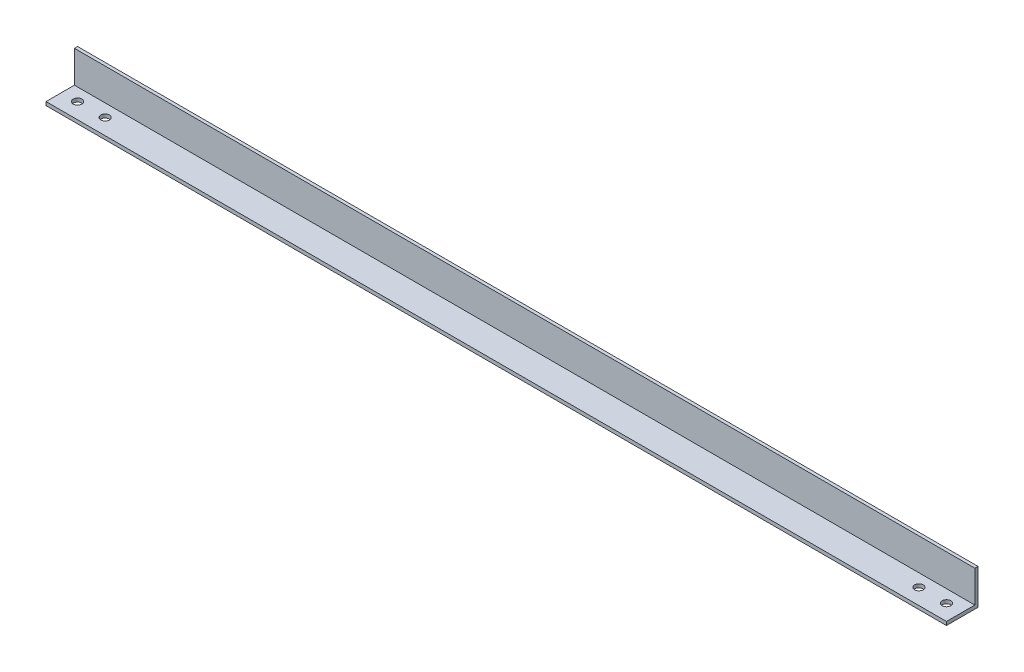
ISO-10303-21;
HEADER;
FILE_DESCRIPTION(('STEP AP214'),'2;1');
FILE_NAME('part.step','',(''),(''),'','','');
FILE_SCHEMA(('AUTOMOTIVE_DESIGN { 1 0 10303 214 1 1 1 1 }'));
ENDSEC;
DATA;
#1=APPLICATION_CONTEXT('core data for automotive mechanical design processes');
#2=APPLICATION_PROTOCOL_DEFINITION('international standard','automotive_design',2000,#1);
#3=PRODUCT_CONTEXT('',#1,'mechanical');
#4=PRODUCT('Part','Part','',(#3));
#5=PRODUCT_RELATED_PRODUCT_CATEGORY('part','',(#4));
#6=PRODUCT_DEFINITION_FORMATION('','',#4);
#7=PRODUCT_DEFINITION_CONTEXT('part definition',#1,'design');
#8=PRODUCT_DEFINITION('design','',#6,#7);
#9=PRODUCT_DEFINITION_SHAPE('','',#8);
#10=(LENGTH_UNIT() NAMED_UNIT(*) SI_UNIT(.MILLI.,.METRE.));
#11=(NAMED_UNIT(*) PLANE_ANGLE_UNIT() SI_UNIT($,.RADIAN.));
#12=(NAMED_UNIT(*) SI_UNIT($,.STERADIAN.) SOLID_ANGLE_UNIT());
#13=UNCERTAINTY_MEASURE_WITH_UNIT(LENGTH_MEASURE(1.E-05),#10,'distance_accuracy_value','');
#14=(GEOMETRIC_REPRESENTATION_CONTEXT(3) GLOBAL_UNCERTAINTY_ASSIGNED_CONTEXT((#13)) GLOBAL_UNIT_ASSIGNED_CONTEXT((#10,
#11,#12)) REPRESENTATION_CONTEXT('',''));
#15=CARTESIAN_POINT('',(0.,0.,0.));
#16=DIRECTION('',(0.,0.,1.));
#17=DIRECTION('',(1.,0.,0.));
#18=AXIS2_PLACEMENT_3D('',#15,#16,#17);
#19=CARTESIAN_POINT('',(0.,0.,8.));
#20=DIRECTION('',(0.,0.,-1.));
#21=DIRECTION('',(-1.,0.,0.));
#22=AXIS2_PLACEMENT_3D('',#19,#20,#21);
#23=PLANE('',#22);
#24=DIRECTION('',(-1.,0.,0.));
#25=VECTOR('',#24,1.);
#26=CARTESIAN_POINT('',(0.,9.,8.));
#27=LINE('',#26,#25);
#28=CARTESIAN_POINT('',(2284.,8.99999999999999,8.));
#29=VERTEX_POINT('',#28);
#30=CARTESIAN_POINT('',(0.,9.,8.));
#31=VERTEX_POINT('',#30);
#32=EDGE_CURVE('E48',#29,#31,#27,.T.);
#33=ORIENTED_EDGE('',*,*,#32,.F.);
#34=DIRECTION('',(0.,1.,0.));
#35=VECTOR('',#34,1.);
#36=CARTESIAN_POINT('',(2284.,0.,8.));
#37=LINE('',#36,#35);
#38=CARTESIAN_POINT('',(2284.,90.,8.));
#39=VERTEX_POINT('',#38);
#40=EDGE_CURVE('E108',#29,#39,#37,.T.);
#41=ORIENTED_EDGE('',*,*,#40,.T.);
#42=DIRECTION('',(-1.,0.,0.));
#43=VECTOR('',#42,1.);
#44=CARTESIAN_POINT('',(0.,90.,8.));
#45=LINE('',#44,#43);
#46=CARTESIAN_POINT('',(0.,90.,8.));
#47=VERTEX_POINT('',#46);
#48=EDGE_CURVE('E54',#39,#47,#45,.T.);
#49=ORIENTED_EDGE('',*,*,#48,.T.);
#50=DIRECTION('',(0.,-1.,0.));
#51=VECTOR('',#50,1.);
#52=CARTESIAN_POINT('',(0.,0.,8.));
#53=LINE('',#52,#51);
#54=EDGE_CURVE('E83',#47,#31,#53,.T.);
#55=ORIENTED_EDGE('',*,*,#54,.T.);
#56=EDGE_LOOP('',(#33,#41,#49,#55));
#57=FACE_BOUND('',#56,.T.);
#58=ADVANCED_FACE('F31',(#57),#23,.F.);
#59=CARTESIAN_POINT('',(0.,0.,8.));
#60=DIRECTION('',(1.,0.,0.));
#61=DIRECTION('',(0.,0.,-1.));
#62=AXIS2_PLACEMENT_3D('',#59,#60,#61);
#63=PLANE('',#62);
#64=DIRECTION('',(0.,-1.,0.));
#65=VECTOR('',#64,1.);
#66=CARTESIAN_POINT('',(0.,0.,0.));
#67=LINE('',#66,#65);
#68=CARTESIAN_POINT('',(0.,90.,0.));
#69=VERTEX_POINT('',#68);
#70=CARTESIAN_POINT('',(0.,0.,0.));
#71=VERTEX_POINT('',#70);
#72=EDGE_CURVE('E89',#69,#71,#67,.T.);
#73=ORIENTED_EDGE('',*,*,#72,.T.);
#74=DIRECTION('',(0.,0.,-1.));
#75=VECTOR('',#74,1.);
#76=CARTESIAN_POINT('',(0.,0.,8.));
#77=LINE('',#76,#75);
#78=CARTESIAN_POINT('',(0.,0.,80.));
#79=VERTEX_POINT('',#78);
#80=EDGE_CURVE('E11',#79,#71,#77,.T.);
#81=ORIENTED_EDGE('',*,*,#80,.F.);
#82=DIRECTION('',(0.,-1.,0.));
#83=VECTOR('',#82,1.);
#84=CARTESIAN_POINT('',(0.,0.,80.));
#85=LINE('',#84,#83);
#86=CARTESIAN_POINT('',(0.,9.,80.));
#87=VERTEX_POINT('',#86);
#88=EDGE_CURVE('E118',#87,#79,#85,.T.);
#89=ORIENTED_EDGE('',*,*,#88,.F.);
#90=DIRECTION('',(0.,0.,-1.));
#91=VECTOR('',#90,1.);
#92=CARTESIAN_POINT('',(0.,9.,80.));
#93=LINE('',#92,#91);
#94=EDGE_CURVE('E98',#87,#31,#93,.T.);
#95=ORIENTED_EDGE('',*,*,#94,.T.);
#96=ORIENTED_EDGE('',*,*,#54,.F.);
#97=DIRECTION('',(0.,0.,-1.));
#98=VECTOR('',#97,1.);
#99=CARTESIAN_POINT('',(0.,90.,8.));
#100=LINE('',#99,#98);
#101=EDGE_CURVE('E76',#47,#69,#100,.T.);
#102=ORIENTED_EDGE('',*,*,#101,.T.);
#103=EDGE_LOOP('',(#73,#81,#89,#95,#96,#102));
#104=FACE_BOUND('',#103,.T.);
#105=ADVANCED_FACE('F33',(#104),#63,.F.);
#106=CARTESIAN_POINT('',(0.,0.,8.));
#107=DIRECTION('',(0.,1.,0.));
#108=DIRECTION('',(0.,0.,1.));
#109=AXIS2_PLACEMENT_3D('',#106,#107,#108);
#110=PLANE('',#109);
#111=CARTESIAN_POINT('',(2244.05,0.,40.));
#112=DIRECTION('',(0.,1.,0.));
#113=DIRECTION('',(0.,0.,1.));
#114=AXIS2_PLACEMENT_3D('',#111,#112,#113);
#115=CIRCLE('',#114,11.0000000000001);
#116=CARTESIAN_POINT('',(2244.05,0.,51.0000000000002));
#117=VERTEX_POINT('',#116);
#118=EDGE_CURVE('E154',#117,#117,#115,.T.);
#119=ORIENTED_EDGE('',*,*,#118,.T.);
#120=EDGE_LOOP('',(#119));
#121=FACE_BOUND('',#120,.T.);
#122=CARTESIAN_POINT('',(2174.05,0.,40.));
#123=DIRECTION('',(0.,1.,0.));
#124=DIRECTION('',(0.,0.,1.));
#125=AXIS2_PLACEMENT_3D('',#122,#123,#124);
#126=CIRCLE('',#125,11.0000000000001);
#127=CARTESIAN_POINT('',(2174.05,0.,51.0000000000001));
#128=VERTEX_POINT('',#127);
#129=EDGE_CURVE('E148',#128,#128,#126,.T.);
#130=ORIENTED_EDGE('',*,*,#129,.T.);
#131=EDGE_LOOP('',(#130));
#132=FACE_BOUND('',#131,.T.);
#133=CARTESIAN_POINT('',(109.95,0.,40.));
#134=DIRECTION('',(0.,1.,0.));
#135=DIRECTION('',(0.,0.,1.));
#136=AXIS2_PLACEMENT_3D('',#133,#134,#135);
#137=CIRCLE('',#136,11.);
#138=CARTESIAN_POINT('',(109.95,0.,51.));
#139=VERTEX_POINT('',#138);
#140=EDGE_CURVE('E142',#139,#139,#137,.T.);
#141=ORIENTED_EDGE('',*,*,#140,.T.);
#142=EDGE_LOOP('',(#141));
#143=FACE_BOUND('',#142,.T.);
#144=CARTESIAN_POINT('',(39.95,0.,40.));
#145=DIRECTION('',(0.,1.,0.));
#146=DIRECTION('',(0.,0.,1.));
#147=AXIS2_PLACEMENT_3D('',#144,#145,#146);
#148=CIRCLE('',#147,11.);
#149=CARTESIAN_POINT('',(39.95,0.,51.));
#150=VERTEX_POINT('',#149);
#151=EDGE_CURVE('E119',#150,#150,#148,.T.);
#152=ORIENTED_EDGE('',*,*,#151,.T.);
#153=EDGE_LOOP('',(#152));
#154=FACE_BOUND('',#153,.T.);
#155=DIRECTION('',(1.,0.,0.));
#156=VECTOR('',#155,1.);
#157=CARTESIAN_POINT('',(0.,0.,0.));
#158=LINE('',#157,#156);
#159=CARTESIAN_POINT('',(2284.,0.,0.));
#160=VERTEX_POINT('',#159);
#161=EDGE_CURVE('E93',#71,#160,#158,.T.);
#162=ORIENTED_EDGE('',*,*,#161,.T.);
#163=DIRECTION('',(0.,0.,-1.));
#164=VECTOR('',#163,1.);
#165=CARTESIAN_POINT('',(2284.,0.,8.));
#166=LINE('',#165,#164);
#167=CARTESIAN_POINT('',(2284.,0.,80.));
#168=VERTEX_POINT('',#167);
#169=EDGE_CURVE('E40',#168,#160,#166,.T.);
#170=ORIENTED_EDGE('',*,*,#169,.F.);
#171=DIRECTION('',(1.,0.,0.));
#172=VECTOR('',#171,1.);
#173=CARTESIAN_POINT('',(0.,0.,80.));
#174=LINE('',#173,#172);
#175=EDGE_CURVE('E131',#79,#168,#174,.T.);
#176=ORIENTED_EDGE('',*,*,#175,.F.);
#177=ORIENTED_EDGE('',*,*,#80,.T.);
#178=EDGE_LOOP('',(#162,#170,#176,#177));
#179=FACE_BOUND('',#178,.T.);
#180=ADVANCED_FACE('F163',(#121,#132,#143,#154,#179),#110,.F.);
#181=CARTESIAN_POINT('',(2284.,0.,8.));
#182=DIRECTION('',(-1.,0.,0.));
#183=DIRECTION('',(0.,0.,1.));
#184=AXIS2_PLACEMENT_3D('',#181,#182,#183);
#185=PLANE('',#184);
#186=DIRECTION('',(0.,1.,0.));
#187=VECTOR('',#186,1.);
#188=CARTESIAN_POINT('',(2284.,0.,0.));
#189=LINE('',#188,#187);
#190=CARTESIAN_POINT('',(2284.,90.,0.));
#191=VERTEX_POINT('',#190);
#192=EDGE_CURVE('E84',#160,#191,#189,.T.);
#193=ORIENTED_EDGE('',*,*,#192,.T.);
#194=DIRECTION('',(0.,0.,-1.));
#195=VECTOR('',#194,1.);
#196=CARTESIAN_POINT('',(2284.,90.,8.));
#197=LINE('',#196,#195);
#198=EDGE_CURVE('E79',#39,#191,#197,.T.);
#199=ORIENTED_EDGE('',*,*,#198,.F.);
#200=ORIENTED_EDGE('',*,*,#40,.F.);
#201=DIRECTION('',(0.,0.,-1.));
#202=VECTOR('',#201,1.);
#203=CARTESIAN_POINT('',(2284.,9.,80.));
#204=LINE('',#203,#202);
#205=CARTESIAN_POINT('',(2284.,9.,80.));
#206=VERTEX_POINT('',#205);
#207=EDGE_CURVE('E94',#206,#29,#204,.T.);
#208=ORIENTED_EDGE('',*,*,#207,.F.);
#209=DIRECTION('',(0.,1.,0.));
#210=VECTOR('',#209,1.);
#211=CARTESIAN_POINT('',(2284.,0.,80.));
#212=LINE('',#211,#210);
#213=EDGE_CURVE('E126',#168,#206,#212,.T.);
#214=ORIENTED_EDGE('',*,*,#213,.F.);
#215=ORIENTED_EDGE('',*,*,#169,.T.);
#216=EDGE_LOOP('',(#193,#199,#200,#208,#214,#215));
#217=FACE_BOUND('',#216,.T.);
#218=ADVANCED_FACE('F194',(#217),#185,.F.);
#219=CARTESIAN_POINT('',(0.,90.,8.));
#220=DIRECTION('',(0.,-1.,0.));
#221=DIRECTION('',(1.,0.,0.));
#222=AXIS2_PLACEMENT_3D('',#219,#220,#221);
#223=PLANE('',#222);
#224=DIRECTION('',(-1.,0.,0.));
#225=VECTOR('',#224,1.);
#226=CARTESIAN_POINT('',(0.,90.,0.));
#227=LINE('',#226,#225);
#228=EDGE_CURVE('E73',#191,#69,#227,.T.);
#229=ORIENTED_EDGE('',*,*,#228,.T.);
#230=ORIENTED_EDGE('',*,*,#101,.F.);
#231=ORIENTED_EDGE('',*,*,#48,.F.);
#232=ORIENTED_EDGE('',*,*,#198,.T.);
#233=EDGE_LOOP('',(#229,#230,#231,#232));
#234=FACE_BOUND('',#233,.T.);
#235=ADVANCED_FACE('F75',(#234),#223,.F.);
#236=CARTESIAN_POINT('',(0.,0.,0.));
#237=DIRECTION('',(0.,0.,-1.));
#238=DIRECTION('',(-1.,0.,0.));
#239=AXIS2_PLACEMENT_3D('',#236,#237,#238);
#240=PLANE('',#239);
#241=ORIENTED_EDGE('',*,*,#72,.F.);
#242=ORIENTED_EDGE('',*,*,#228,.F.);
#243=ORIENTED_EDGE('',*,*,#192,.F.);
#244=ORIENTED_EDGE('',*,*,#161,.F.);
#245=EDGE_LOOP('',(#241,#242,#243,#244));
#246=FACE_BOUND('',#245,.T.);
#247=ADVANCED_FACE('F92',(#246),#240,.T.);
#248=CARTESIAN_POINT('',(0.,9.,80.));
#249=DIRECTION('',(0.,-1.,0.));
#250=DIRECTION('',(0.,0.,-1.));
#251=AXIS2_PLACEMENT_3D('',#248,#249,#250);
#252=PLANE('',#251);
#253=CARTESIAN_POINT('',(2244.05,9.,40.));
#254=DIRECTION('',(0.,1.,0.));
#255=DIRECTION('',(0.,0.,1.));
#256=AXIS2_PLACEMENT_3D('',#253,#254,#255);
#257=CIRCLE('',#256,11.0000000000001);
#258=CARTESIAN_POINT('',(2244.05,9.,51.0000000000002));
#259=VERTEX_POINT('',#258);
#260=EDGE_CURVE('E157',#259,#259,#257,.T.);
#261=ORIENTED_EDGE('',*,*,#260,.F.);
#262=EDGE_LOOP('',(#261));
#263=FACE_BOUND('',#262,.T.);
#264=CARTESIAN_POINT('',(2174.05,9.,40.));
#265=DIRECTION('',(0.,1.,0.));
#266=DIRECTION('',(0.,0.,1.));
#267=AXIS2_PLACEMENT_3D('',#264,#265,#266);
#268=CIRCLE('',#267,11.0000000000001);
#269=CARTESIAN_POINT('',(2174.05,9.,51.0000000000001));
#270=VERTEX_POINT('',#269);
#271=EDGE_CURVE('E151',#270,#270,#268,.T.);
#272=ORIENTED_EDGE('',*,*,#271,.F.);
#273=EDGE_LOOP('',(#272));
#274=FACE_BOUND('',#273,.T.);
#275=CARTESIAN_POINT('',(109.95,9.,40.));
#276=DIRECTION('',(0.,1.,0.));
#277=DIRECTION('',(0.,0.,1.));
#278=AXIS2_PLACEMENT_3D('',#275,#276,#277);
#279=CIRCLE('',#278,11.);
#280=CARTESIAN_POINT('',(109.95,9.,51.));
#281=VERTEX_POINT('',#280);
#282=EDGE_CURVE('E145',#281,#281,#279,.T.);
#283=ORIENTED_EDGE('',*,*,#282,.F.);
#284=EDGE_LOOP('',(#283));
#285=FACE_BOUND('',#284,.T.);
#286=CARTESIAN_POINT('',(39.95,9.,40.));
#287=DIRECTION('',(0.,1.,0.));
#288=DIRECTION('',(0.,0.,1.));
#289=AXIS2_PLACEMENT_3D('',#286,#287,#288);
#290=CIRCLE('',#289,11.);
#291=CARTESIAN_POINT('',(39.95,9.,51.));
#292=VERTEX_POINT('',#291);
#293=EDGE_CURVE('E139',#292,#292,#290,.T.);
#294=ORIENTED_EDGE('',*,*,#293,.F.);
#295=EDGE_LOOP('',(#294));
#296=FACE_BOUND('',#295,.T.);
#297=ORIENTED_EDGE('',*,*,#32,.T.);
#298=ORIENTED_EDGE('',*,*,#94,.F.);
#299=DIRECTION('',(-1.,0.,0.));
#300=VECTOR('',#299,1.);
#301=CARTESIAN_POINT('',(0.,9.,80.));
#302=LINE('',#301,#300);
#303=EDGE_CURVE('E115',#206,#87,#302,.T.);
#304=ORIENTED_EDGE('',*,*,#303,.F.);
#305=ORIENTED_EDGE('',*,*,#207,.T.);
#306=EDGE_LOOP('',(#297,#298,#304,#305));
#307=FACE_BOUND('',#306,.T.);
#308=ADVANCED_FACE('F173',(#263,#274,#285,#296,#307),#252,.F.);
#309=CARTESIAN_POINT('',(0.,9.,80.));
#310=DIRECTION('',(0.,0.,-1.));
#311=DIRECTION('',(-1.,0.,0.));
#312=AXIS2_PLACEMENT_3D('',#309,#310,#311);
#313=PLANE('',#312);
#314=ORIENTED_EDGE('',*,*,#88,.T.);
#315=ORIENTED_EDGE('',*,*,#175,.T.);
#316=ORIENTED_EDGE('',*,*,#213,.T.);
#317=ORIENTED_EDGE('',*,*,#303,.T.);
#318=EDGE_LOOP('',(#314,#315,#316,#317));
#319=FACE_BOUND('',#318,.T.);
#320=ADVANCED_FACE('F176',(#319),#313,.F.);
#321=CARTESIAN_POINT('',(39.95,0.,40.));
#322=DIRECTION('',(0.,1.,0.));
#323=DIRECTION('',(0.,0.,1.));
#324=AXIS2_PLACEMENT_3D('',#321,#322,#323);
#325=CYLINDRICAL_SURFACE('',#324,11.);
#326=ORIENTED_EDGE('',*,*,#151,.F.);
#327=EDGE_LOOP('',(#326));
#328=FACE_BOUND('',#327,.T.);
#329=ORIENTED_EDGE('',*,*,#293,.T.);
#330=EDGE_LOOP('',(#329));
#331=FACE_BOUND('',#330,.T.);
#332=ADVANCED_FACE('F235',(#328,#331),#325,.F.);
#333=CARTESIAN_POINT('',(109.95,0.,40.));
#334=DIRECTION('',(0.,1.,0.));
#335=DIRECTION('',(0.,0.,1.));
#336=AXIS2_PLACEMENT_3D('',#333,#334,#335);
#337=CYLINDRICAL_SURFACE('',#336,11.);
#338=ORIENTED_EDGE('',*,*,#140,.F.);
#339=EDGE_LOOP('',(#338));
#340=FACE_BOUND('',#339,.T.);
#341=ORIENTED_EDGE('',*,*,#282,.T.);
#342=EDGE_LOOP('',(#341));
#343=FACE_BOUND('',#342,.T.);
#344=ADVANCED_FACE('F240',(#340,#343),#337,.F.);
#345=CARTESIAN_POINT('',(2174.05,0.,40.));
#346=DIRECTION('',(0.,1.,0.));
#347=DIRECTION('',(0.,0.,1.));
#348=AXIS2_PLACEMENT_3D('',#345,#346,#347);
#349=CYLINDRICAL_SURFACE('',#348,11.0000000000001);
#350=ORIENTED_EDGE('',*,*,#129,.F.);
#351=EDGE_LOOP('',(#350));
#352=FACE_BOUND('',#351,.T.);
#353=ORIENTED_EDGE('',*,*,#271,.T.);
#354=EDGE_LOOP('',(#353));
#355=FACE_BOUND('',#354,.T.);
#356=ADVANCED_FACE('F169',(#352,#355),#349,.F.);
#357=CARTESIAN_POINT('',(2244.05,0.,40.));
#358=DIRECTION('',(0.,1.,0.));
#359=DIRECTION('',(0.,0.,1.));
#360=AXIS2_PLACEMENT_3D('',#357,#358,#359);
#361=CYLINDRICAL_SURFACE('',#360,11.0000000000001);
#362=ORIENTED_EDGE('',*,*,#118,.F.);
#363=EDGE_LOOP('',(#362));
#364=FACE_BOUND('',#363,.T.);
#365=ORIENTED_EDGE('',*,*,#260,.T.);
#366=EDGE_LOOP('',(#365));
#367=FACE_BOUND('',#366,.T.);
#368=ADVANCED_FACE('F166',(#364,#367),#361,.F.);
#369=CLOSED_SHELL('',(#58,#105,#180,#218,#235,#247,#308,#320,#332,#344,#356,#368));
#370=MANIFOLD_SOLID_BREP('B2',#369);
#371=ADVANCED_BREP_SHAPE_REPRESENTATION('',(#18,#370),#14);
#372=SHAPE_DEFINITION_REPRESENTATION(#9,#371);
ENDSEC;
END-ISO-10303-21;
